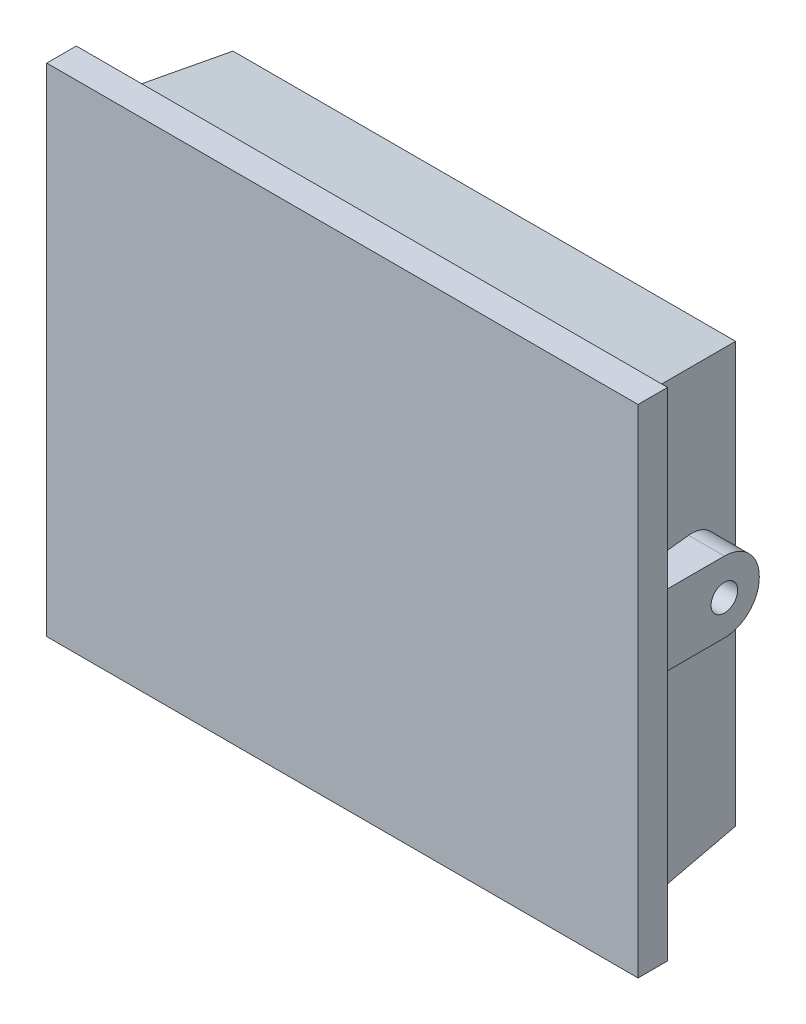
ISO-10303-21;
HEADER;
FILE_DESCRIPTION(('STEP AP214'),'2;1');
FILE_NAME('part.step','',(''),(''),'','','');
FILE_SCHEMA(('AUTOMOTIVE_DESIGN { 1 0 10303 214 1 1 1 1 }'));
ENDSEC;
DATA;
#1=APPLICATION_CONTEXT('core data for automotive mechanical design processes');
#2=APPLICATION_PROTOCOL_DEFINITION('international standard','automotive_design',2000,#1);
#3=PRODUCT_CONTEXT('',#1,'mechanical');
#4=PRODUCT('Part','Part','',(#3));
#5=PRODUCT_RELATED_PRODUCT_CATEGORY('part','',(#4));
#6=PRODUCT_DEFINITION_FORMATION('','',#4);
#7=PRODUCT_DEFINITION_CONTEXT('part definition',#1,'design');
#8=PRODUCT_DEFINITION('design','',#6,#7);
#9=PRODUCT_DEFINITION_SHAPE('','',#8);
#10=(LENGTH_UNIT() NAMED_UNIT(*) SI_UNIT(.MILLI.,.METRE.));
#11=(NAMED_UNIT(*) PLANE_ANGLE_UNIT() SI_UNIT($,.RADIAN.));
#12=(NAMED_UNIT(*) SI_UNIT($,.STERADIAN.) SOLID_ANGLE_UNIT());
#13=UNCERTAINTY_MEASURE_WITH_UNIT(LENGTH_MEASURE(1.E-05),#10,'distance_accuracy_value','');
#14=(GEOMETRIC_REPRESENTATION_CONTEXT(3) GLOBAL_UNCERTAINTY_ASSIGNED_CONTEXT((#13)) GLOBAL_UNIT_ASSIGNED_CONTEXT((#10,
#11,#12)) REPRESENTATION_CONTEXT('',''));
#15=CARTESIAN_POINT('',(0.,0.,0.));
#16=DIRECTION('',(0.,0.,1.));
#17=DIRECTION('',(1.,0.,0.));
#18=AXIS2_PLACEMENT_3D('',#15,#16,#17);
#19=CARTESIAN_POINT('',(0.,0.,0.));
#20=DIRECTION('',(0.,0.,-1.));
#21=DIRECTION('',(-1.,0.,0.));
#22=AXIS2_PLACEMENT_3D('',#19,#20,#21);
#23=PLANE('',#22);
#24=DIRECTION('',(0.,1.,0.));
#25=VECTOR('',#24,1.);
#26=CARTESIAN_POINT('',(50.,-42.,0.));
#27=LINE('',#26,#25);
#28=CARTESIAN_POINT('',(50.,-42.,0.));
#29=VERTEX_POINT('',#28);
#30=CARTESIAN_POINT('',(50.,42.,0.));
#31=VERTEX_POINT('',#30);
#32=EDGE_CURVE('E268',#29,#31,#27,.T.);
#33=ORIENTED_EDGE('',*,*,#32,.F.);
#34=DIRECTION('',(1.,0.,0.));
#35=VECTOR('',#34,1.);
#36=CARTESIAN_POINT('',(-50.,-42.,0.));
#37=LINE('',#36,#35);
#38=CARTESIAN_POINT('',(-50.,-42.,0.));
#39=VERTEX_POINT('',#38);
#40=EDGE_CURVE('E290',#39,#29,#37,.T.);
#41=ORIENTED_EDGE('',*,*,#40,.F.);
#42=DIRECTION('',(0.,-1.,0.));
#43=VECTOR('',#42,1.);
#44=CARTESIAN_POINT('',(-50.,-42.,0.));
#45=LINE('',#44,#43);
#46=CARTESIAN_POINT('',(-50.,42.,0.));
#47=VERTEX_POINT('',#46);
#48=EDGE_CURVE('E301',#47,#39,#45,.T.);
#49=ORIENTED_EDGE('',*,*,#48,.F.);
#50=DIRECTION('',(-1.,0.,0.));
#51=VECTOR('',#50,1.);
#52=CARTESIAN_POINT('',(-50.,42.,0.));
#53=LINE('',#52,#51);
#54=EDGE_CURVE('E299',#31,#47,#53,.T.);
#55=ORIENTED_EDGE('',*,*,#54,.F.);
#56=EDGE_LOOP('',(#33,#41,#49,#55));
#57=FACE_BOUND('',#56,.T.);
#58=DIRECTION('',(0.,-1.,0.));
#59=VECTOR('',#58,1.);
#60=CARTESIAN_POINT('',(44.5,-37.5,0.));
#61=LINE('',#60,#59);
#62=CARTESIAN_POINT('',(44.5,0.,0.));
#63=VERTEX_POINT('',#62);
#64=CARTESIAN_POINT('',(44.5,-37.5,0.));
#65=VERTEX_POINT('',#64);
#66=EDGE_CURVE('E251',#63,#65,#61,.T.);
#67=ORIENTED_EDGE('',*,*,#66,.F.);
#68=DIRECTION('',(-1.,0.,0.));
#69=VECTOR('',#68,1.);
#70=CARTESIAN_POINT('',(49.5,0.,0.));
#71=LINE('',#70,#69);
#72=CARTESIAN_POINT('',(49.5,0.,0.));
#73=VERTEX_POINT('',#72);
#74=EDGE_CURVE('E50',#73,#63,#71,.T.);
#75=ORIENTED_EDGE('',*,*,#74,.F.);
#76=DIRECTION('',(0.,-1.,0.));
#77=VECTOR('',#76,1.);
#78=CARTESIAN_POINT('',(49.5,12.,0.));
#79=LINE('',#78,#77);
#80=CARTESIAN_POINT('',(49.5,12.,0.));
#81=VERTEX_POINT('',#80);
#82=EDGE_CURVE('E55',#81,#73,#79,.T.);
#83=ORIENTED_EDGE('',*,*,#82,.F.);
#84=DIRECTION('',(-1.,0.,0.));
#85=VECTOR('',#84,1.);
#86=CARTESIAN_POINT('',(49.5,12.,0.));
#87=LINE('',#86,#85);
#88=CARTESIAN_POINT('',(44.5,12.,0.));
#89=VERTEX_POINT('',#88);
#90=EDGE_CURVE('E222',#81,#89,#87,.T.);
#91=ORIENTED_EDGE('',*,*,#90,.T.);
#92=CARTESIAN_POINT('',(44.5,37.5,0.));
#93=VERTEX_POINT('',#92);
#94=EDGE_CURVE('E252',#93,#89,#61,.T.);
#95=ORIENTED_EDGE('',*,*,#94,.F.);
#96=DIRECTION('',(1.,0.,0.));
#97=VECTOR('',#96,1.);
#98=CARTESIAN_POINT('',(-44.5,37.5,0.));
#99=LINE('',#98,#97);
#100=CARTESIAN_POINT('',(-44.5,37.5,0.));
#101=VERTEX_POINT('',#100);
#102=EDGE_CURVE('E261',#101,#93,#99,.T.);
#103=ORIENTED_EDGE('',*,*,#102,.F.);
#104=DIRECTION('',(0.,1.,0.));
#105=VECTOR('',#104,1.);
#106=CARTESIAN_POINT('',(-44.5,-37.5,0.));
#107=LINE('',#106,#105);
#108=CARTESIAN_POINT('',(-44.5,12.,0.));
#109=VERTEX_POINT('',#108);
#110=EDGE_CURVE('E257',#109,#101,#107,.T.);
#111=ORIENTED_EDGE('',*,*,#110,.F.);
#112=CARTESIAN_POINT('',(-49.5,12.,0.));
#113=VERTEX_POINT('',#112);
#114=EDGE_CURVE('E203',#109,#113,#87,.T.);
#115=ORIENTED_EDGE('',*,*,#114,.T.);
#116=DIRECTION('',(0.,-1.,0.));
#117=VECTOR('',#116,1.);
#118=CARTESIAN_POINT('',(-49.5,12.,0.));
#119=LINE('',#118,#117);
#120=CARTESIAN_POINT('',(-49.5,0.,0.));
#121=VERTEX_POINT('',#120);
#122=EDGE_CURVE('E204',#113,#121,#119,.T.);
#123=ORIENTED_EDGE('',*,*,#122,.T.);
#124=CARTESIAN_POINT('',(-44.5,0.,0.));
#125=VERTEX_POINT('',#124);
#126=EDGE_CURVE('E187',#125,#121,#71,.T.);
#127=ORIENTED_EDGE('',*,*,#126,.F.);
#128=CARTESIAN_POINT('',(-44.5,-37.5,0.));
#129=VERTEX_POINT('',#128);
#130=EDGE_CURVE('E258',#129,#125,#107,.T.);
#131=ORIENTED_EDGE('',*,*,#130,.F.);
#132=DIRECTION('',(-1.,0.,0.));
#133=VECTOR('',#132,1.);
#134=CARTESIAN_POINT('',(-44.5,-37.5,0.));
#135=LINE('',#134,#133);
#136=EDGE_CURVE('E254',#65,#129,#135,.T.);
#137=ORIENTED_EDGE('',*,*,#136,.F.);
#138=EDGE_LOOP('',(#67,#75,#83,#91,#95,#103,#111,#115,#123,#127,#131,#137));
#139=FACE_BOUND('',#138,.T.);
#140=ADVANCED_FACE('F35',(#57,#139),#23,.T.);
#141=CARTESIAN_POINT('',(50.,-42.,5.));
#142=DIRECTION('',(-1.,0.,0.));
#143=DIRECTION('',(0.,0.,1.));
#144=AXIS2_PLACEMENT_3D('',#141,#142,#143);
#145=PLANE('',#144);
#146=ORIENTED_EDGE('',*,*,#32,.T.);
#147=DIRECTION('',(0.,0.,-1.));
#148=VECTOR('',#147,1.);
#149=CARTESIAN_POINT('',(50.,42.,5.));
#150=LINE('',#149,#148);
#151=CARTESIAN_POINT('',(50.,42.,5.));
#152=VERTEX_POINT('',#151);
#153=EDGE_CURVE('E312',#152,#31,#150,.T.);
#154=ORIENTED_EDGE('',*,*,#153,.F.);
#155=DIRECTION('',(0.,1.,0.));
#156=VECTOR('',#155,1.);
#157=CARTESIAN_POINT('',(50.,-42.,5.));
#158=LINE('',#157,#156);
#159=CARTESIAN_POINT('',(50.,-42.,5.));
#160=VERTEX_POINT('',#159);
#161=EDGE_CURVE('E286',#160,#152,#158,.T.);
#162=ORIENTED_EDGE('',*,*,#161,.F.);
#163=DIRECTION('',(0.,0.,-1.));
#164=VECTOR('',#163,1.);
#165=CARTESIAN_POINT('',(50.,-42.,5.));
#166=LINE('',#165,#164);
#167=EDGE_CURVE('E296',#160,#29,#166,.T.);
#168=ORIENTED_EDGE('',*,*,#167,.T.);
#169=EDGE_LOOP('',(#146,#154,#162,#168));
#170=FACE_BOUND('',#169,.T.);
#171=ADVANCED_FACE('F37',(#170),#145,.F.);
#172=CARTESIAN_POINT('',(-50.,42.,5.));
#173=DIRECTION('',(0.,-1.,0.));
#174=DIRECTION('',(0.,0.,-1.));
#175=AXIS2_PLACEMENT_3D('',#172,#173,#174);
#176=PLANE('',#175);
#177=ORIENTED_EDGE('',*,*,#54,.T.);
#178=DIRECTION('',(0.,0.,-1.));
#179=VECTOR('',#178,1.);
#180=CARTESIAN_POINT('',(-50.,42.,5.));
#181=LINE('',#180,#179);
#182=CARTESIAN_POINT('',(-50.,42.,5.));
#183=VERTEX_POINT('',#182);
#184=EDGE_CURVE('E309',#183,#47,#181,.T.);
#185=ORIENTED_EDGE('',*,*,#184,.F.);
#186=DIRECTION('',(-1.,0.,0.));
#187=VECTOR('',#186,1.);
#188=CARTESIAN_POINT('',(-50.,42.,5.));
#189=LINE('',#188,#187);
#190=EDGE_CURVE('E289',#152,#183,#189,.T.);
#191=ORIENTED_EDGE('',*,*,#190,.F.);
#192=ORIENTED_EDGE('',*,*,#153,.T.);
#193=EDGE_LOOP('',(#177,#185,#191,#192));
#194=FACE_BOUND('',#193,.T.);
#195=ADVANCED_FACE('F403',(#194),#176,.F.);
#196=CARTESIAN_POINT('',(-50.,-42.,5.));
#197=DIRECTION('',(1.,0.,0.));
#198=DIRECTION('',(0.,0.,-1.));
#199=AXIS2_PLACEMENT_3D('',#196,#197,#198);
#200=PLANE('',#199);
#201=ORIENTED_EDGE('',*,*,#48,.T.);
#202=DIRECTION('',(0.,0.,-1.));
#203=VECTOR('',#202,1.);
#204=CARTESIAN_POINT('',(-50.,-42.,5.));
#205=LINE('',#204,#203);
#206=CARTESIAN_POINT('',(-50.,-42.,5.));
#207=VERTEX_POINT('',#206);
#208=EDGE_CURVE('E306',#207,#39,#205,.T.);
#209=ORIENTED_EDGE('',*,*,#208,.F.);
#210=DIRECTION('',(0.,-1.,0.));
#211=VECTOR('',#210,1.);
#212=CARTESIAN_POINT('',(-50.,-42.,5.));
#213=LINE('',#212,#211);
#214=EDGE_CURVE('E292',#183,#207,#213,.T.);
#215=ORIENTED_EDGE('',*,*,#214,.F.);
#216=ORIENTED_EDGE('',*,*,#184,.T.);
#217=EDGE_LOOP('',(#201,#209,#215,#216));
#218=FACE_BOUND('',#217,.T.);
#219=ADVANCED_FACE('F413',(#218),#200,.F.);
#220=CARTESIAN_POINT('',(-50.,-42.,5.));
#221=DIRECTION('',(0.,1.,0.));
#222=DIRECTION('',(0.,0.,1.));
#223=AXIS2_PLACEMENT_3D('',#220,#221,#222);
#224=PLANE('',#223);
#225=ORIENTED_EDGE('',*,*,#40,.T.);
#226=ORIENTED_EDGE('',*,*,#167,.F.);
#227=DIRECTION('',(1.,0.,0.));
#228=VECTOR('',#227,1.);
#229=CARTESIAN_POINT('',(-50.,-42.,5.));
#230=LINE('',#229,#228);
#231=EDGE_CURVE('E294',#207,#160,#230,.T.);
#232=ORIENTED_EDGE('',*,*,#231,.F.);
#233=ORIENTED_EDGE('',*,*,#208,.T.);
#234=EDGE_LOOP('',(#225,#226,#232,#233));
#235=FACE_BOUND('',#234,.T.);
#236=ADVANCED_FACE('F410',(#235),#224,.F.);
#237=CARTESIAN_POINT('',(0.,0.,5.));
#238=DIRECTION('',(0.,0.,-1.));
#239=DIRECTION('',(-1.,0.,0.));
#240=AXIS2_PLACEMENT_3D('',#237,#238,#239);
#241=PLANE('',#240);
#242=ORIENTED_EDGE('',*,*,#161,.T.);
#243=ORIENTED_EDGE('',*,*,#190,.T.);
#244=ORIENTED_EDGE('',*,*,#214,.T.);
#245=ORIENTED_EDGE('',*,*,#231,.T.);
#246=EDGE_LOOP('',(#242,#243,#244,#245));
#247=FACE_BOUND('',#246,.T.);
#248=ADVANCED_FACE('F408',(#247),#241,.F.);
#249=CARTESIAN_POINT('',(44.5,-37.5,0.));
#250=DIRECTION('',(0.994521895368273,0.,-0.104528463267654));
#251=DIRECTION('',(-0.104528463267654,0.,-0.994521895368273));
#252=AXIS2_PLACEMENT_3D('',#249,#250,#251);
#253=PLANE('',#252);
#254=DIRECTION('',(0.104528463267654,0.,0.994521895368273));
#255=VECTOR('',#254,1.);
#256=CARTESIAN_POINT('',(44.5,0.,0.));
#257=LINE('',#256,#255);
#258=CARTESIAN_POINT('',(43.4384472238167,0.,-10.1));
#259=VERTEX_POINT('',#258);
#260=EDGE_CURVE('E184',#63,#259,#257,.F.);
#261=ORIENTED_EDGE('',*,*,#260,.F.);
#262=ORIENTED_EDGE('',*,*,#66,.T.);
#263=DIRECTION('',(0.103962051184498,-0.103962051184498,0.989132844377854));
#264=VECTOR('',#263,1.);
#265=CARTESIAN_POINT('',(43.5380783803026,-36.5380783803026,-9.15207286619758));
#266=LINE('',#265,#264);
#267=CARTESIAN_POINT('',(42.5030195299521,-35.5030195299522,-19.));
#268=VERTEX_POINT('',#267);
#269=EDGE_CURVE('E265',#268,#65,#266,.T.);
#270=ORIENTED_EDGE('',*,*,#269,.F.);
#271=DIRECTION('',(0.,1.,0.));
#272=VECTOR('',#271,1.);
#273=CARTESIAN_POINT('',(42.5030195299521,-37.5,-19.));
#274=LINE('',#273,#272);
#275=CARTESIAN_POINT('',(42.5030195299521,35.5030195299521,-19.));
#276=VERTEX_POINT('',#275);
#277=EDGE_CURVE('E264',#276,#268,#274,.F.);
#278=ORIENTED_EDGE('',*,*,#277,.F.);
#279=DIRECTION('',(0.103962051184498,0.103962051184498,0.989132844377854));
#280=VECTOR('',#279,1.);
#281=CARTESIAN_POINT('',(43.6893918935134,36.6893918935134,-7.71242095466088));
#282=LINE('',#281,#280);
#283=EDGE_CURVE('E270',#276,#93,#282,.T.);
#284=ORIENTED_EDGE('',*,*,#283,.T.);
#285=ORIENTED_EDGE('',*,*,#94,.T.);
#286=DIRECTION('',(-0.104528463267654,0.,-0.994521895368273));
#287=VECTOR('',#286,1.);
#288=CARTESIAN_POINT('',(44.5,12.,0.));
#289=LINE('',#288,#287);
#290=CARTESIAN_POINT('',(43.4384472238167,12.,-10.1));
#291=VERTEX_POINT('',#290);
#292=EDGE_CURVE('E239',#291,#89,#289,.F.);
#293=ORIENTED_EDGE('',*,*,#292,.F.);
#294=CARTESIAN_POINT('',(43.4384472238167,6.10000000000001,-10.1));
#295=DIRECTION('',(0.994521895368273,0.,-0.104528463267654));
#296=DIRECTION('',(-0.104528463267654,0.,-0.994521895368273));
#297=AXIS2_PLACEMENT_3D('',#294,#295,#296);
#298=ELLIPSE('',#297,5.93249884942475,5.9);
#299=CARTESIAN_POINT('',(42.8183322357492,6.10000000000001,-16.));
#300=VERTEX_POINT('',#299);
#301=EDGE_CURVE('E242',#300,#291,#298,.T.);
#302=ORIENTED_EDGE('',*,*,#301,.F.);
#303=DIRECTION('',(0.,-1.,0.));
#304=VECTOR('',#303,1.);
#305=CARTESIAN_POINT('',(42.8183322357492,-37.5,-16.));
#306=LINE('',#305,#304);
#307=CARTESIAN_POINT('',(42.8183322357492,5.90000000000001,-16.));
#308=VERTEX_POINT('',#307);
#309=EDGE_CURVE('E245',#308,#300,#306,.F.);
#310=ORIENTED_EDGE('',*,*,#309,.F.);
#311=CARTESIAN_POINT('',(43.4384472238167,5.90000000000001,-10.1));
#312=DIRECTION('',(0.994521895368273,0.,-0.104528463267654));
#313=DIRECTION('',(-0.104528463267654,0.,-0.994521895368273));
#314=AXIS2_PLACEMENT_3D('',#311,#312,#313);
#315=ELLIPSE('',#314,5.93249884942475,5.9);
#316=EDGE_CURVE('E248',#259,#308,#315,.T.);
#317=ORIENTED_EDGE('',*,*,#316,.F.);
#318=EDGE_LOOP('',(#261,#262,#270,#278,#284,#285,#293,#302,#310,#317));
#319=FACE_BOUND('',#318,.T.);
#320=ADVANCED_FACE('F370',(#319),#253,.T.);
#321=CARTESIAN_POINT('',(-44.5,-37.5,0.));
#322=DIRECTION('',(0.,-0.994521895368273,-0.104528463267654));
#323=DIRECTION('',(0.,0.104528463267654,-0.994521895368273));
#324=AXIS2_PLACEMENT_3D('',#321,#322,#323);
#325=PLANE('',#324);
#326=ORIENTED_EDGE('',*,*,#136,.T.);
#327=DIRECTION('',(-0.103962051184498,-0.103962051184498,0.989132844377854));
#328=VECTOR('',#327,1.);
#329=CARTESIAN_POINT('',(-44.5,-37.5,0.));
#330=LINE('',#329,#328);
#331=CARTESIAN_POINT('',(-42.5030195299521,-35.5030195299521,-19.));
#332=VERTEX_POINT('',#331);
#333=EDGE_CURVE('E269',#332,#129,#330,.T.);
#334=ORIENTED_EDGE('',*,*,#333,.F.);
#335=DIRECTION('',(1.,0.,0.));
#336=VECTOR('',#335,1.);
#337=CARTESIAN_POINT('',(-44.5,-35.5030195299521,-19.));
#338=LINE('',#337,#336);
#339=EDGE_CURVE('E281',#268,#332,#338,.F.);
#340=ORIENTED_EDGE('',*,*,#339,.F.);
#341=ORIENTED_EDGE('',*,*,#269,.T.);
#342=EDGE_LOOP('',(#326,#334,#340,#341));
#343=FACE_BOUND('',#342,.T.);
#344=ADVANCED_FACE('F367',(#343),#325,.T.);
#345=CARTESIAN_POINT('',(-44.5,-37.5,0.));
#346=DIRECTION('',(-0.994521895368273,0.,-0.104528463267654));
#347=DIRECTION('',(-0.104528463267654,0.,0.994521895368273));
#348=AXIS2_PLACEMENT_3D('',#345,#346,#347);
#349=PLANE('',#348);
#350=DIRECTION('',(0.104528463267654,0.,-0.994521895368273));
#351=VECTOR('',#350,1.);
#352=CARTESIAN_POINT('',(-44.5,0.,0.));
#353=LINE('',#352,#351);
#354=CARTESIAN_POINT('',(-43.4384472238167,0.,-10.1));
#355=VERTEX_POINT('',#354);
#356=EDGE_CURVE('E11',#355,#125,#353,.F.);
#357=ORIENTED_EDGE('',*,*,#356,.F.);
#358=CARTESIAN_POINT('',(-43.4384472238167,5.90000000000001,-10.1));
#359=DIRECTION('',(-0.994521895368273,0.,-0.104528463267654));
#360=DIRECTION('',(-0.104528463267654,0.,0.994521895368273));
#361=AXIS2_PLACEMENT_3D('',#358,#359,#360);
#362=ELLIPSE('',#361,5.93249884942475,5.9);
#363=CARTESIAN_POINT('',(-42.8183322357492,5.90000000000001,-16.));
#364=VERTEX_POINT('',#363);
#365=EDGE_CURVE('E43',#364,#355,#362,.T.);
#366=ORIENTED_EDGE('',*,*,#365,.F.);
#367=DIRECTION('',(0.,1.,0.));
#368=VECTOR('',#367,1.);
#369=CARTESIAN_POINT('',(-42.8183322357492,-37.5,-16.));
#370=LINE('',#369,#368);
#371=CARTESIAN_POINT('',(-42.8183322357492,6.10000000000001,-16.));
#372=VERTEX_POINT('',#371);
#373=EDGE_CURVE('E323',#372,#364,#370,.F.);
#374=ORIENTED_EDGE('',*,*,#373,.F.);
#375=CARTESIAN_POINT('',(-43.4384472238167,6.10000000000001,-10.1));
#376=DIRECTION('',(-0.994521895368273,0.,-0.104528463267654));
#377=DIRECTION('',(-0.104528463267654,0.,0.994521895368273));
#378=AXIS2_PLACEMENT_3D('',#375,#376,#377);
#379=ELLIPSE('',#378,5.93249884942475,5.9);
#380=CARTESIAN_POINT('',(-43.4384472238167,12.,-10.1));
#381=VERTEX_POINT('',#380);
#382=EDGE_CURVE('E320',#381,#372,#379,.T.);
#383=ORIENTED_EDGE('',*,*,#382,.F.);
#384=DIRECTION('',(-0.104528463267654,0.,0.994521895368273));
#385=VECTOR('',#384,1.);
#386=CARTESIAN_POINT('',(-44.5,12.,0.));
#387=LINE('',#386,#385);
#388=EDGE_CURVE('E315',#109,#381,#387,.F.);
#389=ORIENTED_EDGE('',*,*,#388,.F.);
#390=ORIENTED_EDGE('',*,*,#110,.T.);
#391=DIRECTION('',(-0.103962051184498,0.103962051184498,0.989132844377854));
#392=VECTOR('',#391,1.);
#393=CARTESIAN_POINT('',(-44.5,37.5,0.));
#394=LINE('',#393,#392);
#395=CARTESIAN_POINT('',(-42.5030195299521,35.5030195299521,-19.));
#396=VERTEX_POINT('',#395);
#397=EDGE_CURVE('E273',#396,#101,#394,.T.);
#398=ORIENTED_EDGE('',*,*,#397,.F.);
#399=DIRECTION('',(0.,-1.,0.));
#400=VECTOR('',#399,1.);
#401=CARTESIAN_POINT('',(-42.5030195299521,-37.5,-19.));
#402=LINE('',#401,#400);
#403=EDGE_CURVE('E283',#332,#396,#402,.F.);
#404=ORIENTED_EDGE('',*,*,#403,.F.);
#405=ORIENTED_EDGE('',*,*,#333,.T.);
#406=ORIENTED_EDGE('',*,*,#130,.T.);
#407=EDGE_LOOP('',(#357,#366,#374,#383,#389,#390,#398,#404,#405,#406));
#408=FACE_BOUND('',#407,.T.);
#409=ADVANCED_FACE('F346',(#408),#349,.T.);
#410=CARTESIAN_POINT('',(-44.5,37.5,0.));
#411=DIRECTION('',(0.,0.994521895368273,-0.104528463267654));
#412=DIRECTION('',(0.,0.104528463267654,0.994521895368273));
#413=AXIS2_PLACEMENT_3D('',#410,#411,#412);
#414=PLANE('',#413);
#415=ORIENTED_EDGE('',*,*,#102,.T.);
#416=ORIENTED_EDGE('',*,*,#283,.F.);
#417=DIRECTION('',(-1.,0.,0.));
#418=VECTOR('',#417,1.);
#419=CARTESIAN_POINT('',(-44.5,35.5030195299521,-19.));
#420=LINE('',#419,#418);
#421=EDGE_CURVE('E274',#396,#276,#420,.F.);
#422=ORIENTED_EDGE('',*,*,#421,.F.);
#423=ORIENTED_EDGE('',*,*,#397,.T.);
#424=EDGE_LOOP('',(#415,#416,#422,#423));
#425=FACE_BOUND('',#424,.T.);
#426=ADVANCED_FACE('F359',(#425),#414,.T.);
#427=CARTESIAN_POINT('',(0.,0.,-19.));
#428=DIRECTION('',(0.,0.,-1.));
#429=DIRECTION('',(-1.,0.,0.));
#430=AXIS2_PLACEMENT_3D('',#427,#428,#429);
#431=PLANE('',#430);
#432=ORIENTED_EDGE('',*,*,#277,.T.);
#433=ORIENTED_EDGE('',*,*,#339,.T.);
#434=ORIENTED_EDGE('',*,*,#403,.T.);
#435=ORIENTED_EDGE('',*,*,#421,.T.);
#436=EDGE_LOOP('',(#432,#433,#434,#435));
#437=FACE_BOUND('',#436,.T.);
#438=ADVANCED_FACE('F363',(#437),#431,.T.);
#439=CARTESIAN_POINT('',(49.5,5.90000000000001,-10.1));
#440=DIRECTION('',(-1.,0.,0.));
#441=DIRECTION('',(0.,0.,1.));
#442=AXIS2_PLACEMENT_3D('',#439,#440,#441);
#443=CYLINDRICAL_SURFACE('',#442,2.25);
#444=CARTESIAN_POINT('',(-49.5,5.90000000000001,-10.1));
#445=DIRECTION('',(1.,0.,0.));
#446=DIRECTION('',(0.,0.,-1.));
#447=AXIS2_PLACEMENT_3D('',#444,#445,#446);
#448=CIRCLE('',#447,2.25);
#449=CARTESIAN_POINT('',(-49.5,5.90000000000001,-12.35));
#450=VERTEX_POINT('',#449);
#451=EDGE_CURVE('E621',#450,#450,#448,.T.);
#452=ORIENTED_EDGE('',*,*,#451,.F.);
#453=EDGE_LOOP('',(#452));
#454=FACE_BOUND('',#453,.T.);
#455=CARTESIAN_POINT('',(-43.4384472238167,5.90000000000001,-10.1));
#456=DIRECTION('',(-0.994521895368273,0.,-0.104528463267654));
#457=DIRECTION('',(-0.104528463267654,0.,0.994521895368273));
#458=AXIS2_PLACEMENT_3D('',#455,#456,#457);
#459=ELLIPSE('',#458,2.26239362901791,2.25);
#460=CARTESIAN_POINT('',(-43.6749317531644,5.90000000000001,-7.85));
#461=VERTEX_POINT('',#460);
#462=EDGE_CURVE('E235',#461,#461,#459,.T.);
#463=ORIENTED_EDGE('',*,*,#462,.F.);
#464=EDGE_LOOP('',(#463));
#465=FACE_BOUND('',#464,.T.);
#466=ADVANCED_FACE('F391',(#454,#465),#443,.F.);
#467=CARTESIAN_POINT('',(49.5,12.,0.));
#468=DIRECTION('',(0.,-1.,0.));
#469=DIRECTION('',(0.,0.,-1.));
#470=AXIS2_PLACEMENT_3D('',#467,#468,#469);
#471=PLANE('',#470);
#472=ORIENTED_EDGE('',*,*,#114,.F.);
#473=ORIENTED_EDGE('',*,*,#388,.T.);
#474=DIRECTION('',(-1.,0.,0.));
#475=VECTOR('',#474,1.);
#476=CARTESIAN_POINT('',(49.5,12.,-10.1));
#477=LINE('',#476,#475);
#478=CARTESIAN_POINT('',(-49.5,12.,-10.1));
#479=VERTEX_POINT('',#478);
#480=EDGE_CURVE('E224',#381,#479,#477,.T.);
#481=ORIENTED_EDGE('',*,*,#480,.T.);
#482=DIRECTION('',(0.,0.,1.));
#483=VECTOR('',#482,1.);
#484=CARTESIAN_POINT('',(-49.5,12.,0.));
#485=LINE('',#484,#483);
#486=EDGE_CURVE('E219',#479,#113,#485,.T.);
#487=ORIENTED_EDGE('',*,*,#486,.T.);
#488=EDGE_LOOP('',(#472,#473,#481,#487));
#489=FACE_BOUND('',#488,.T.);
#490=ADVANCED_FACE('F352',(#489),#471,.F.);
#491=CARTESIAN_POINT('',(49.5,6.10000000000001,-10.1));
#492=DIRECTION('',(-1.,0.,0.));
#493=DIRECTION('',(0.,0.,1.));
#494=AXIS2_PLACEMENT_3D('',#491,#492,#493);
#495=CYLINDRICAL_SURFACE('',#494,5.9);
#496=ORIENTED_EDGE('',*,*,#480,.F.);
#497=ORIENTED_EDGE('',*,*,#382,.T.);
#498=DIRECTION('',(-1.,0.,0.));
#499=VECTOR('',#498,1.);
#500=CARTESIAN_POINT('',(49.5,6.10000000000001,-16.));
#501=LINE('',#500,#499);
#502=CARTESIAN_POINT('',(-49.5,6.10000000000001,-16.));
#503=VERTEX_POINT('',#502);
#504=EDGE_CURVE('E228',#372,#503,#501,.T.);
#505=ORIENTED_EDGE('',*,*,#504,.T.);
#506=CARTESIAN_POINT('',(-49.5,6.10000000000001,-10.1));
#507=DIRECTION('',(1.,0.,0.));
#508=DIRECTION('',(0.,0.,1.));
#509=AXIS2_PLACEMENT_3D('',#506,#507,#508);
#510=CIRCLE('',#509,5.9);
#511=EDGE_CURVE('E216',#503,#479,#510,.T.);
#512=ORIENTED_EDGE('',*,*,#511,.T.);
#513=EDGE_LOOP('',(#496,#497,#505,#512));
#514=FACE_BOUND('',#513,.T.);
#515=ADVANCED_FACE('F349',(#514),#495,.T.);
#516=CARTESIAN_POINT('',(49.5,6.10000000000001,-16.));
#517=DIRECTION('',(0.,0.,1.));
#518=DIRECTION('',(1.,0.,0.));
#519=AXIS2_PLACEMENT_3D('',#516,#517,#518);
#520=PLANE('',#519);
#521=ORIENTED_EDGE('',*,*,#504,.F.);
#522=ORIENTED_EDGE('',*,*,#373,.T.);
#523=DIRECTION('',(-1.,0.,0.));
#524=VECTOR('',#523,1.);
#525=CARTESIAN_POINT('',(49.5,5.90000000000001,-16.));
#526=LINE('',#525,#524);
#527=CARTESIAN_POINT('',(-49.5,5.90000000000001,-16.));
#528=VERTEX_POINT('',#527);
#529=EDGE_CURVE('E232',#364,#528,#526,.T.);
#530=ORIENTED_EDGE('',*,*,#529,.T.);
#531=DIRECTION('',(0.,1.,0.));
#532=VECTOR('',#531,1.);
#533=CARTESIAN_POINT('',(-49.5,6.10000000000001,-16.));
#534=LINE('',#533,#532);
#535=EDGE_CURVE('E213',#528,#503,#534,.T.);
#536=ORIENTED_EDGE('',*,*,#535,.T.);
#537=EDGE_LOOP('',(#521,#522,#530,#536));
#538=FACE_BOUND('',#537,.T.);
#539=ADVANCED_FACE('F345',(#538),#520,.F.);
#540=CARTESIAN_POINT('',(49.5,5.90000000000001,-10.1));
#541=DIRECTION('',(-1.,0.,0.));
#542=DIRECTION('',(0.,0.,1.));
#543=AXIS2_PLACEMENT_3D('',#540,#541,#542);
#544=CYLINDRICAL_SURFACE('',#543,5.9);
#545=ORIENTED_EDGE('',*,*,#529,.F.);
#546=ORIENTED_EDGE('',*,*,#365,.T.);
#547=DIRECTION('',(-1.,0.,0.));
#548=VECTOR('',#547,1.);
#549=CARTESIAN_POINT('',(49.5,0.,-10.1));
#550=LINE('',#549,#548);
#551=CARTESIAN_POINT('',(-49.5,0.,-10.1));
#552=VERTEX_POINT('',#551);
#553=EDGE_CURVE('E188',#355,#552,#550,.T.);
#554=ORIENTED_EDGE('',*,*,#553,.T.);
#555=CARTESIAN_POINT('',(-49.5,5.90000000000001,-10.1));
#556=DIRECTION('',(1.,0.,0.));
#557=DIRECTION('',(0.,0.,-1.));
#558=AXIS2_PLACEMENT_3D('',#555,#556,#557);
#559=CIRCLE('',#558,5.9);
#560=EDGE_CURVE('E210',#552,#528,#559,.T.);
#561=ORIENTED_EDGE('',*,*,#560,.T.);
#562=EDGE_LOOP('',(#545,#546,#554,#561));
#563=FACE_BOUND('',#562,.T.);
#564=ADVANCED_FACE('F329',(#563),#544,.T.);
#565=CARTESIAN_POINT('',(49.5,0.,0.));
#566=DIRECTION('',(0.,1.,0.));
#567=DIRECTION('',(0.,0.,1.));
#568=AXIS2_PLACEMENT_3D('',#565,#566,#567);
#569=PLANE('',#568);
#570=ORIENTED_EDGE('',*,*,#553,.F.);
#571=ORIENTED_EDGE('',*,*,#356,.T.);
#572=ORIENTED_EDGE('',*,*,#126,.T.);
#573=DIRECTION('',(0.,0.,-1.));
#574=VECTOR('',#573,1.);
#575=CARTESIAN_POINT('',(-49.5,0.,0.));
#576=LINE('',#575,#574);
#577=EDGE_CURVE('E206',#121,#552,#576,.T.);
#578=ORIENTED_EDGE('',*,*,#577,.T.);
#579=EDGE_LOOP('',(#570,#571,#572,#578));
#580=FACE_BOUND('',#579,.T.);
#581=ADVANCED_FACE('F332',(#580),#569,.F.);
#582=CARTESIAN_POINT('',(-49.5,5.90000000000001,-10.1));
#583=DIRECTION('',(1.,0.,0.));
#584=DIRECTION('',(0.,0.,-1.));
#585=AXIS2_PLACEMENT_3D('',#582,#583,#584);
#586=PLANE('',#585);
#587=ORIENTED_EDGE('',*,*,#122,.F.);
#588=ORIENTED_EDGE('',*,*,#486,.F.);
#589=ORIENTED_EDGE('',*,*,#511,.F.);
#590=ORIENTED_EDGE('',*,*,#535,.F.);
#591=ORIENTED_EDGE('',*,*,#560,.F.);
#592=ORIENTED_EDGE('',*,*,#577,.F.);
#593=EDGE_LOOP('',(#587,#588,#589,#590,#591,#592));
#594=FACE_BOUND('',#593,.T.);
#595=ORIENTED_EDGE('',*,*,#451,.T.);
#596=EDGE_LOOP('',(#595));
#597=FACE_BOUND('',#596,.T.);
#598=ADVANCED_FACE('F339',(#594,#597),#586,.F.);
#599=ORIENTED_EDGE('',*,*,#74,.T.);
#600=ORIENTED_EDGE('',*,*,#260,.T.);
#601=CARTESIAN_POINT('',(49.5,0.,-10.1));
#602=VERTEX_POINT('',#601);
#603=EDGE_CURVE('E182',#602,#259,#550,.T.);
#604=ORIENTED_EDGE('',*,*,#603,.F.);
#605=DIRECTION('',(0.,0.,-1.));
#606=VECTOR('',#605,1.);
#607=CARTESIAN_POINT('',(49.5,0.,0.));
#608=LINE('',#607,#606);
#609=EDGE_CURVE('E171',#73,#602,#608,.T.);
#610=ORIENTED_EDGE('',*,*,#609,.F.);
#611=EDGE_LOOP('',(#599,#600,#604,#610));
#612=FACE_BOUND('',#611,.T.);
#613=ADVANCED_FACE('F183',(#612),#569,.F.);
#614=ORIENTED_EDGE('',*,*,#603,.T.);
#615=ORIENTED_EDGE('',*,*,#316,.T.);
#616=CARTESIAN_POINT('',(49.5,5.90000000000001,-16.));
#617=VERTEX_POINT('',#616);
#618=EDGE_CURVE('E192',#617,#308,#526,.T.);
#619=ORIENTED_EDGE('',*,*,#618,.F.);
#620=CARTESIAN_POINT('',(49.5,5.90000000000001,-10.1));
#621=DIRECTION('',(1.,0.,0.));
#622=DIRECTION('',(0.,0.,-1.));
#623=AXIS2_PLACEMENT_3D('',#620,#621,#622);
#624=CIRCLE('',#623,5.9);
#625=EDGE_CURVE('E176',#602,#617,#624,.T.);
#626=ORIENTED_EDGE('',*,*,#625,.F.);
#627=EDGE_LOOP('',(#614,#615,#619,#626));
#628=FACE_BOUND('',#627,.T.);
#629=ADVANCED_FACE('F190',(#628),#544,.T.);
#630=ORIENTED_EDGE('',*,*,#618,.T.);
#631=ORIENTED_EDGE('',*,*,#309,.T.);
#632=CARTESIAN_POINT('',(49.5,6.10000000000001,-16.));
#633=VERTEX_POINT('',#632);
#634=EDGE_CURVE('E229',#633,#300,#501,.T.);
#635=ORIENTED_EDGE('',*,*,#634,.F.);
#636=DIRECTION('',(0.,1.,0.));
#637=VECTOR('',#636,1.);
#638=CARTESIAN_POINT('',(49.5,6.10000000000001,-16.));
#639=LINE('',#638,#637);
#640=EDGE_CURVE('E194',#617,#633,#639,.T.);
#641=ORIENTED_EDGE('',*,*,#640,.F.);
#642=EDGE_LOOP('',(#630,#631,#635,#641));
#643=FACE_BOUND('',#642,.T.);
#644=ADVANCED_FACE('F372',(#643),#520,.F.);
#645=ORIENTED_EDGE('',*,*,#634,.T.);
#646=ORIENTED_EDGE('',*,*,#301,.T.);
#647=CARTESIAN_POINT('',(49.5,12.,-10.1));
#648=VERTEX_POINT('',#647);
#649=EDGE_CURVE('E225',#648,#291,#477,.T.);
#650=ORIENTED_EDGE('',*,*,#649,.F.);
#651=CARTESIAN_POINT('',(49.5,6.10000000000001,-10.1));
#652=DIRECTION('',(1.,0.,0.));
#653=DIRECTION('',(0.,0.,1.));
#654=AXIS2_PLACEMENT_3D('',#651,#652,#653);
#655=CIRCLE('',#654,5.9);
#656=EDGE_CURVE('E196',#633,#648,#655,.T.);
#657=ORIENTED_EDGE('',*,*,#656,.F.);
#658=EDGE_LOOP('',(#645,#646,#650,#657));
#659=FACE_BOUND('',#658,.T.);
#660=ADVANCED_FACE('F379',(#659),#495,.T.);
#661=ORIENTED_EDGE('',*,*,#649,.T.);
#662=ORIENTED_EDGE('',*,*,#292,.T.);
#663=ORIENTED_EDGE('',*,*,#90,.F.);
#664=DIRECTION('',(0.,0.,1.));
#665=VECTOR('',#664,1.);
#666=CARTESIAN_POINT('',(49.5,12.,0.));
#667=LINE('',#666,#665);
#668=EDGE_CURVE('E201',#648,#81,#667,.T.);
#669=ORIENTED_EDGE('',*,*,#668,.F.);
#670=EDGE_LOOP('',(#661,#662,#663,#669));
#671=FACE_BOUND('',#670,.T.);
#672=ADVANCED_FACE('F381',(#671),#471,.F.);
#673=CARTESIAN_POINT('',(49.5,5.90000000000001,-10.1));
#674=DIRECTION('',(1.,0.,0.));
#675=DIRECTION('',(0.,0.,-1.));
#676=AXIS2_PLACEMENT_3D('',#673,#674,#675);
#677=CIRCLE('',#676,2.25);
#678=CARTESIAN_POINT('',(49.5,5.90000000000001,-12.35));
#679=VERTEX_POINT('',#678);
#680=EDGE_CURVE('E207',#679,#679,#677,.T.);
#681=ORIENTED_EDGE('',*,*,#680,.T.);
#682=EDGE_LOOP('',(#681));
#683=FACE_BOUND('',#682,.T.);
#684=CARTESIAN_POINT('',(43.4384472238167,5.90000000000001,-10.1));
#685=DIRECTION('',(0.994521895368273,0.,-0.104528463267654));
#686=DIRECTION('',(-0.104528463267654,0.,-0.994521895368273));
#687=AXIS2_PLACEMENT_3D('',#684,#685,#686);
#688=ELLIPSE('',#687,2.26239362901791,2.25);
#689=CARTESIAN_POINT('',(43.2019626944689,5.90000000000001,-12.35));
#690=VERTEX_POINT('',#689);
#691=EDGE_CURVE('E236',#690,#690,#688,.T.);
#692=ORIENTED_EDGE('',*,*,#691,.F.);
#693=EDGE_LOOP('',(#692));
#694=FACE_BOUND('',#693,.T.);
#695=ADVANCED_FACE('F383',(#683,#694),#443,.F.);
#696=CARTESIAN_POINT('',(49.5,5.90000000000001,-10.1));
#697=DIRECTION('',(1.,0.,0.));
#698=DIRECTION('',(0.,0.,-1.));
#699=AXIS2_PLACEMENT_3D('',#696,#697,#698);
#700=PLANE('',#699);
#701=ORIENTED_EDGE('',*,*,#82,.T.);
#702=ORIENTED_EDGE('',*,*,#609,.T.);
#703=ORIENTED_EDGE('',*,*,#625,.T.);
#704=ORIENTED_EDGE('',*,*,#640,.T.);
#705=ORIENTED_EDGE('',*,*,#656,.T.);
#706=ORIENTED_EDGE('',*,*,#668,.T.);
#707=EDGE_LOOP('',(#701,#702,#703,#704,#705,#706));
#708=FACE_BOUND('',#707,.T.);
#709=ORIENTED_EDGE('',*,*,#680,.F.);
#710=EDGE_LOOP('',(#709));
#711=FACE_BOUND('',#710,.T.);
#712=ADVANCED_FACE('F173',(#708,#711),#700,.T.);
#713=ORIENTED_EDGE('',*,*,#462,.T.);
#714=EDGE_LOOP('',(#713));
#715=FACE_BOUND('',#714,.T.);
#716=ADVANCED_FACE('F443',(#715),#349,.T.);
#717=ORIENTED_EDGE('',*,*,#691,.T.);
#718=EDGE_LOOP('',(#717));
#719=FACE_BOUND('',#718,.T.);
#720=ADVANCED_FACE('F436',(#719),#253,.T.);
#721=CLOSED_SHELL('',(#140,#171,#195,#219,#236,#248,#320,#344,#409,#426,#438,#466,#490,#515,
#539,#564,#581,#598,#613,#629,#644,#660,#672,#695,#712,#716,#720));
#722=MANIFOLD_SOLID_BREP('B2',#721);
#723=ADVANCED_BREP_SHAPE_REPRESENTATION('',(#18,#722),#14);
#724=SHAPE_DEFINITION_REPRESENTATION(#9,#723);
ENDSEC;
END-ISO-10303-21;
